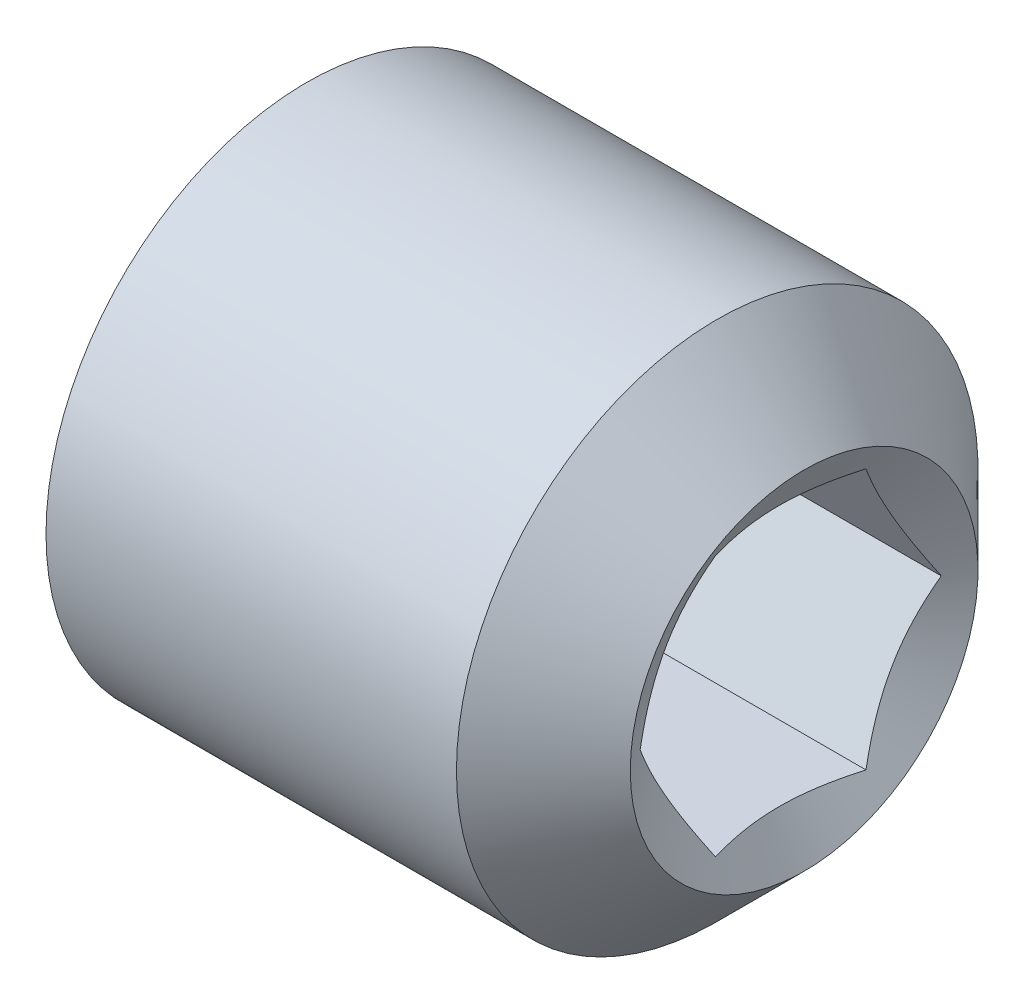
ISO-10303-21;
HEADER;
FILE_DESCRIPTION(('STEP AP214'),'2;1');
FILE_NAME('part.step','',(''),(''),'','','');
FILE_SCHEMA(('AUTOMOTIVE_DESIGN { 1 0 10303 214 1 1 1 1 }'));
ENDSEC;
DATA;
#1=APPLICATION_CONTEXT('core data for automotive mechanical design processes');
#2=APPLICATION_PROTOCOL_DEFINITION('international standard','automotive_design',2000,#1);
#3=PRODUCT_CONTEXT('',#1,'mechanical');
#4=PRODUCT('Part','Part','',(#3));
#5=PRODUCT_RELATED_PRODUCT_CATEGORY('part','',(#4));
#6=PRODUCT_DEFINITION_FORMATION('','',#4);
#7=PRODUCT_DEFINITION_CONTEXT('part definition',#1,'design');
#8=PRODUCT_DEFINITION('design','',#6,#7);
#9=PRODUCT_DEFINITION_SHAPE('','',#8);
#10=(LENGTH_UNIT() NAMED_UNIT(*) SI_UNIT(.MILLI.,.METRE.));
#11=(NAMED_UNIT(*) PLANE_ANGLE_UNIT() SI_UNIT($,.RADIAN.));
#12=(NAMED_UNIT(*) SI_UNIT($,.STERADIAN.) SOLID_ANGLE_UNIT());
#13=UNCERTAINTY_MEASURE_WITH_UNIT(LENGTH_MEASURE(1.E-05),#10,'distance_accuracy_value','');
#14=(GEOMETRIC_REPRESENTATION_CONTEXT(3) GLOBAL_UNCERTAINTY_ASSIGNED_CONTEXT((#13)) GLOBAL_UNIT_ASSIGNED_CONTEXT((#10,
#11,#12)) REPRESENTATION_CONTEXT('',''));
#15=CARTESIAN_POINT('',(0.,0.,0.));
#16=DIRECTION('',(0.,0.,1.));
#17=DIRECTION('',(1.,0.,0.));
#18=AXIS2_PLACEMENT_3D('',#15,#16,#17);
#19=CARTESIAN_POINT('',(0.,0.,0.));
#20=DIRECTION('',(-1.,0.,0.));
#21=DIRECTION('',(0.,0.,1.));
#22=AXIS2_PLACEMENT_3D('',#19,#20,#21);
#23=PLANE('',#22);
#24=CARTESIAN_POINT('',(0.,0.,0.));
#25=DIRECTION('',(-1.,0.,0.));
#26=DIRECTION('',(0.,0.,1.));
#27=AXIS2_PLACEMENT_3D('',#24,#25,#26);
#28=CIRCLE('',#27,5.036);
#29=CARTESIAN_POINT('',(0.,0.,5.036));
#30=VERTEX_POINT('',#29);
#31=EDGE_CURVE('E138',#30,#30,#28,.T.);
#32=ORIENTED_EDGE('',*,*,#31,.T.);
#33=EDGE_LOOP('',(#32));
#34=FACE_BOUND('',#33,.T.);
#35=DIRECTION('',(0.,0.,-1.));
#36=VECTOR('',#35,1.);
#37=CARTESIAN_POINT('',(0.,3.,1.73205080756888));
#38=LINE('',#37,#36);
#39=CARTESIAN_POINT('',(0.,3.,1.73205080756888));
#40=VERTEX_POINT('',#39);
#41=CARTESIAN_POINT('',(0.,3.,-1.73205080756888));
#42=VERTEX_POINT('',#41);
#43=EDGE_CURVE('E111',#40,#42,#38,.T.);
#44=ORIENTED_EDGE('',*,*,#43,.F.);
#45=DIRECTION('',(0.,-0.866025403784439,0.5));
#46=VECTOR('',#45,1.);
#47=CARTESIAN_POINT('',(0.,3.,1.73205080756888));
#48=LINE('',#47,#46);
#49=CARTESIAN_POINT('',(0.,0.,3.46410161513775));
#50=VERTEX_POINT('',#49);
#51=EDGE_CURVE('E55',#40,#50,#48,.T.);
#52=ORIENTED_EDGE('',*,*,#51,.T.);
#53=DIRECTION('',(0.,0.866025403784439,0.5));
#54=VECTOR('',#53,1.);
#55=CARTESIAN_POINT('',(0.,-3.,1.73205080756888));
#56=LINE('',#55,#54);
#57=CARTESIAN_POINT('',(0.,-3.,1.73205080756888));
#58=VERTEX_POINT('',#57);
#59=EDGE_CURVE('E101',#58,#50,#56,.T.);
#60=ORIENTED_EDGE('',*,*,#59,.F.);
#61=DIRECTION('',(0.,0.,-1.));
#62=VECTOR('',#61,1.);
#63=CARTESIAN_POINT('',(0.,-3.,1.73205080756888));
#64=LINE('',#63,#62);
#65=CARTESIAN_POINT('',(0.,-3.,-1.73205080756888));
#66=VERTEX_POINT('',#65);
#67=EDGE_CURVE('E107',#58,#66,#64,.T.);
#68=ORIENTED_EDGE('',*,*,#67,.T.);
#69=DIRECTION('',(0.,0.866025403784439,-0.5));
#70=VECTOR('',#69,1.);
#71=CARTESIAN_POINT('',(0.,-3.,-1.73205080756888));
#72=LINE('',#71,#70);
#73=CARTESIAN_POINT('',(0.,0.,-3.46410161513776));
#74=VERTEX_POINT('',#73);
#75=EDGE_CURVE('E115',#66,#74,#72,.T.);
#76=ORIENTED_EDGE('',*,*,#75,.T.);
#77=DIRECTION('',(0.,-0.866025403784439,-0.5));
#78=VECTOR('',#77,1.);
#79=CARTESIAN_POINT('',(0.,3.,-1.73205080756888));
#80=LINE('',#79,#78);
#81=EDGE_CURVE('E118',#42,#74,#80,.T.);
#82=ORIENTED_EDGE('',*,*,#81,.F.);
#83=EDGE_LOOP('',(#44,#52,#60,#68,#76,#82));
#84=FACE_BOUND('',#83,.T.);
#85=ADVANCED_FACE('F35',(#34,#84),#23,.T.);
#86=CARTESIAN_POINT('',(9.69059892324151,0.,0.));
#87=DIRECTION('',(1.,0.,0.));
#88=DIRECTION('',(0.,0.,-1.));
#89=AXIS2_PLACEMENT_3D('',#86,#87,#88);
#90=CONICAL_SURFACE('',#89,0.,1.0471975511966);
#91=CARTESIAN_POINT('',(12.,0.,0.));
#92=DIRECTION('',(-1.,0.,0.));
#93=DIRECTION('',(0.,0.,1.));
#94=AXIS2_PLACEMENT_3D('',#91,#92,#93);
#95=CIRCLE('',#94,4.);
#96=CARTESIAN_POINT('',(12.,0.,4.));
#97=VERTEX_POINT('',#96);
#98=EDGE_CURVE('E97',#97,#97,#95,.T.);
#99=ORIENTED_EDGE('',*,*,#98,.F.);
#100=EDGE_LOOP('',(#99));
#101=FACE_BOUND('',#100,.T.);
#102=CARTESIAN_POINT('',(11.6906655932414,3.0002,1.73193533751504));
#103=CARTESIAN_POINT('',(11.6467034352627,2.86836479341167,1.80805042952748));
#104=CARTESIAN_POINT('',(11.606721317103,2.73539159464476,1.88482254163057));
#105=CARTESIAN_POINT('',(11.5369318112558,2.46714257999795,2.03969618244675));
#106=CARTESIAN_POINT('',(11.5071491130758,2.33186199736566,2.11780046324563));
#107=CARTESIAN_POINT('',(11.4607875700216,2.06297739790352,2.27304105912604));
#108=CARTESIAN_POINT('',(11.4439001719333,1.92941475457054,2.35015348720802));
#109=CARTESIAN_POINT('',(11.4237393732589,1.66166094270431,2.50474122256553));
#110=CARTESIAN_POINT('',(11.4204492785915,1.52747074752016,2.58221596787771));
#111=CARTESIAN_POINT('',(11.4272902616958,1.2767244023042,2.72698443778646));
#112=CARTESIAN_POINT('',(11.435741645003,1.16013073502733,2.79429982297457));
#113=CARTESIAN_POINT('',(11.4625286738174,0.927703015025367,2.92849202968483));
#114=CARTESIAN_POINT('',(11.4808734716721,0.811869766348672,2.99536838698943));
#115=CARTESIAN_POINT('',(11.5267344816637,0.578962742943636,3.12983731964848));
#116=CARTESIAN_POINT('',(11.5544451160735,0.461918449486062,3.19741287398332));
#117=CARTESIAN_POINT('',(11.6173375259478,0.229575649500878,3.33155605209904));
#118=CARTESIAN_POINT('',(11.6525045218319,0.114274165828896,3.39812539473502));
#119=CARTESIAN_POINT('',(11.6906655932414,-0.000199999999997181,3.46421708519159));
#120=B_SPLINE_CURVE_WITH_KNOTS('',3,(#102,#103,#104,#105,#106,#107,#108,#109,#110,#111,#112,
#113,#114,#115,#116,#117,#118,#119),.UNSPECIFIED.,.F.,.F.,(4,2,2,2,2,2,2,2,4),(0.,
0.475539830103041,0.952222784107965,1.41710776961288,1.88142182298026,2.28572436316091,
2.69040156475039,3.10405572063576,3.5168974940707),.UNSPECIFIED.);
#121=CARTESIAN_POINT('',(11.6905989232415,3.,1.73205080756888));
#122=VERTEX_POINT('',#121);
#123=CARTESIAN_POINT('',(11.6905989232415,0.,3.46410161513775));
#124=VERTEX_POINT('',#123);
#125=EDGE_CURVE('E11',#122,#124,#120,.T.);
#126=ORIENTED_EDGE('',*,*,#125,.F.);
#127=CARTESIAN_POINT('',(12.840336640365,3.,-4.55659336127451));
#128=CARTESIAN_POINT('',(12.7775183066443,3.,-4.42628672844495));
#129=CARTESIAN_POINT('',(12.7153309655419,3.,-4.29567032494813));
#130=CARTESIAN_POINT('',(12.5925754309235,3.,-4.03365274149774));
#131=CARTESIAN_POINT('',(12.5320075139129,3.,-3.90225143215388));
#132=CARTESIAN_POINT('',(12.4125226094255,3.,-3.63777496634161));
#133=CARTESIAN_POINT('',(12.3536172920187,3.,-3.50469451834562));
#134=CARTESIAN_POINT('',(12.2383508803078,3.,-3.23744031909387));
#135=CARTESIAN_POINT('',(12.1819896584255,3.,-3.10326662306021));
#136=CARTESIAN_POINT('',(12.0709277695581,3.,-2.82977330303893));
#137=CARTESIAN_POINT('',(12.0163198280995,3.,-2.69041580838828));
#138=CARTESIAN_POINT('',(11.9114740307778,3.,-2.41003573054797));
#139=CARTESIAN_POINT('',(11.8612366777946,3.,-2.26901295786603));
#140=CARTESIAN_POINT('',(11.7665209311448,3.,-1.98537413289822));
#141=CARTESIAN_POINT('',(11.7220300182339,3.,-1.84276230547271));
#142=CARTESIAN_POINT('',(11.6402969069347,3.,-1.55549698900339));
#143=CARTESIAN_POINT('',(11.6030523235803,3.,-1.41084418856835));
#144=CARTESIAN_POINT('',(11.537839902926,3.,-1.12014497293236));
#145=CARTESIAN_POINT('',(11.5098288315497,3.,-0.974108444190145));
#146=CARTESIAN_POINT('',(11.4647495967925,3.,-0.680325608016572));
#147=CARTESIAN_POINT('',(11.4476805281331,3.,-0.532579443060636));
#148=CARTESIAN_POINT('',(11.4260708908031,3.,-0.23800167284546));
#149=CARTESIAN_POINT('',(11.421376892111,3.,-0.0911816042653944));
#150=CARTESIAN_POINT('',(11.4245169584137,3.,0.202335554134728));
#151=CARTESIAN_POINT('',(11.4323516727024,3.,0.349032637186917));
#152=CARTESIAN_POINT('',(11.4560257507122,3.,0.600951629579026));
#153=CARTESIAN_POINT('',(11.469060608016,3.,0.706450994842633));
#154=CARTESIAN_POINT('',(11.5007453308884,3.,0.916609115223871));
#155=CARTESIAN_POINT('',(11.5193960393217,3.,1.02126774173529));
#156=CARTESIAN_POINT('',(11.5827840958792,3.,1.33387598596371));
#157=CARTESIAN_POINT('',(11.6349442068949,3.,1.54033357100199));
#158=CARTESIAN_POINT('',(11.7245575357159,3.,1.84908487891427));
#159=CARTESIAN_POINT('',(11.7567482398301,3.,1.95299589282556));
#160=CARTESIAN_POINT('',(11.8242569956809,3.,2.1598068394969));
#161=CARTESIAN_POINT('',(11.8595750701436,3.,2.2627067649035));
#162=CARTESIAN_POINT('',(11.9327896613409,3.,2.46753423262475));
#163=CARTESIAN_POINT('',(11.9706852263751,3.,2.5694621181701));
#164=CARTESIAN_POINT('',(12.0486305002987,3.,2.77248625415285));
#165=CARTESIAN_POINT('',(12.0886801686461,3.,2.87358252020081));
#166=CARTESIAN_POINT('',(12.1962687561814,3.,3.13826972104612));
#167=CARTESIAN_POINT('',(12.2652842000421,3.,3.30125980379003));
#168=CARTESIAN_POINT('',(12.4068707022034,3.,3.62569332832884));
#169=CARTESIAN_POINT('',(12.4794420705356,3.,3.78713663379199));
#170=CARTESIAN_POINT('',(12.627315499474,3.,4.10881818146874));
#171=CARTESIAN_POINT('',(12.7026183093158,3.00000000000001,4.26905607826113));
#172=CARTESIAN_POINT('',(12.8553307943668,3.00000000000001,4.58852645189722));
#173=CARTESIAN_POINT('',(12.9327405221607,3.00000000000001,4.74775890352445));
#174=CARTESIAN_POINT('',(13.1676336135943,3.00000000000001,5.22465756645368));
#175=CARTESIAN_POINT('',(13.327585417931,3.00000000000001,5.54110663352526));
#176=CARTESIAN_POINT('',(13.6516726538817,3.00000000000001,6.17177335504186));
#177=CARTESIAN_POINT('',(13.8158073859139,3.00000000000001,6.48599137152855));
#178=CARTESIAN_POINT('',(14.1305139282583,3.00000000000001,7.08177137884172));
#179=CARTESIAN_POINT('',(14.2808137659135,3.00000000000001,7.36347726630862));
#180=CARTESIAN_POINT('',(14.5831324665193,3.00000000000001,7.92598154858902));
#181=CARTESIAN_POINT('',(14.7351514137229,3.00000000000001,8.20677989804955));
#182=CARTESIAN_POINT('',(15.040043621536,3.00000000000001,8.76689184921073));
#183=CARTESIAN_POINT('',(15.1929132935827,3.00000000000001,9.04620740650452));
#184=CARTESIAN_POINT('',(15.4996413094233,3.00000000000001,9.60427181112733));
#185=CARTESIAN_POINT('',(15.653499588575,3.00000000000001,9.88302069397183));
#186=CARTESIAN_POINT('',(15.8077189294779,3.00000000000001,10.1615683588752));
#187=B_SPLINE_CURVE_WITH_KNOTS('',3,(#127,#128,#129,#130,#131,#132,#133,#134,#135,#136,#137,
#138,#139,#140,#141,#142,#143,#144,#145,#146,#147,#148,#149,#150,#151,#152,#153,#154,#155,#156,
#157,#158,#159,#160,#161,#162,#163,#164,#165,#166,#167,#168,#169,#170,#171,#172,#173,#174,#175,
#176,#177,#178,#179,#180,#181,#182,#183,#184,#185,#186),.UNSPECIFIED.,.F.,.F.,(4,2,2,2,2,2,2,2,
2,2,2,2,2,2,2,2,2,2,2,2,2,2,2,2,2,2,2,2,2,4),(0.,0.433980061359352,0.868033754620581,
1.30461549717309,1.74117532217407,2.19014305696267,2.63916238183425,3.08718634825249,
3.53506260730817,3.98081095903989,4.42652242734654,4.86668125465067,5.30686289369446,
5.62561131441227,5.94440759890004,6.58237376963243,6.9086979291812,7.23502446026578,
7.56123114742701,7.88743169723455,8.41836853092384,8.94935173825066,9.48048171260251,
10.0116249551526,11.0752966882769,12.138791678188,13.0966636327847,14.0545827376494,
15.0098170543448,15.9649895339161),.UNSPECIFIED.);
#188=CARTESIAN_POINT('',(11.6905989232415,3.,-1.73205080756888));
#189=VERTEX_POINT('',#188);
#190=EDGE_CURVE('E141',#122,#189,#187,.F.);
#191=ORIENTED_EDGE('',*,*,#190,.T.);
#192=CARTESIAN_POINT('',(11.6906655932414,3.0002,-1.73193533751504));
#193=CARTESIAN_POINT('',(11.6467034352627,2.86836479341167,-1.80805042952749));
#194=CARTESIAN_POINT('',(11.606721317103,2.73539159464475,-1.88482254163057));
#195=CARTESIAN_POINT('',(11.5369318112558,2.46714257999795,-2.03969618244676));
#196=CARTESIAN_POINT('',(11.5071491130758,2.33186199736566,-2.11780046324564));
#197=CARTESIAN_POINT('',(11.4607875700216,2.06297739790352,-2.27304105912605));
#198=CARTESIAN_POINT('',(11.4439001719333,1.92941475457054,-2.35015348720802));
#199=CARTESIAN_POINT('',(11.4237393732589,1.66166094270431,-2.50474122256554));
#200=CARTESIAN_POINT('',(11.4204492785915,1.52747074752016,-2.58221596787772));
#201=CARTESIAN_POINT('',(11.4272902616958,1.27672440230419,-2.72698443778647));
#202=CARTESIAN_POINT('',(11.435741645003,1.16013073502733,-2.79429982297458));
#203=CARTESIAN_POINT('',(11.4625286738174,0.927703015025365,-2.92849202968484));
#204=CARTESIAN_POINT('',(11.4808734716721,0.81186976634867,-2.99536838698944));
#205=CARTESIAN_POINT('',(11.5267344816637,0.578962742943634,-3.12983731964849));
#206=CARTESIAN_POINT('',(11.5544451160735,0.461918449486061,-3.19741287398333));
#207=CARTESIAN_POINT('',(11.6173375259478,0.229575649500877,-3.33155605209905));
#208=CARTESIAN_POINT('',(11.6525045218319,0.114274165828896,-3.39812539473503));
#209=CARTESIAN_POINT('',(11.6906655932414,-0.000199999999997537,-3.4642170851916));
#210=B_SPLINE_CURVE_WITH_KNOTS('',3,(#192,#193,#194,#195,#196,#197,#198,#199,#200,#201,#202,
#203,#204,#205,#206,#207,#208,#209),.UNSPECIFIED.,.F.,.F.,(4,2,2,2,2,2,2,2,4),(0.,
0.475539830103041,0.952222784107966,1.41710776961288,1.88142182298026,2.28572436316091,
2.69040156475039,3.10405572063576,3.5168974940707),.UNSPECIFIED.);
#211=CARTESIAN_POINT('',(11.6905989232415,0.,-3.46410161513776));
#212=VERTEX_POINT('',#211);
#213=EDGE_CURVE('E149',#189,#212,#210,.T.);
#214=ORIENTED_EDGE('',*,*,#213,.T.);
#215=CARTESIAN_POINT('',(11.6906655932414,-3.0002,-1.73193533751504));
#216=CARTESIAN_POINT('',(11.6467034352627,-2.86836479341167,-1.80805042952749));
#217=CARTESIAN_POINT('',(11.606721317103,-2.73539159464475,-1.88482254163057));
#218=CARTESIAN_POINT('',(11.5369318112558,-2.46714257999794,-2.03969618244676));
#219=CARTESIAN_POINT('',(11.5071491130758,-2.33186199736566,-2.11780046324564));
#220=CARTESIAN_POINT('',(11.4607875700216,-2.06297739790352,-2.27304105912605));
#221=CARTESIAN_POINT('',(11.4439001719333,-1.92941475457054,-2.35015348720802));
#222=CARTESIAN_POINT('',(11.4237393732589,-1.66166094270431,-2.50474122256554));
#223=CARTESIAN_POINT('',(11.4204492785915,-1.52747074752016,-2.58221596787772));
#224=CARTESIAN_POINT('',(11.4272902616958,-1.27672440230419,-2.72698443778647));
#225=CARTESIAN_POINT('',(11.435741645003,-1.16013073502732,-2.79429982297457));
#226=CARTESIAN_POINT('',(11.4625286738174,-0.927703015025362,-2.92849202968484));
#227=CARTESIAN_POINT('',(11.4808734716721,-0.811869766348667,-2.99536838698944));
#228=CARTESIAN_POINT('',(11.5267344816637,-0.57896274294363,-3.12983731964849));
#229=CARTESIAN_POINT('',(11.5544451160735,-0.461918449486057,-3.19741287398333));
#230=CARTESIAN_POINT('',(11.6173375259478,-0.229575649500873,-3.33155605209904));
#231=CARTESIAN_POINT('',(11.6525045218319,-0.114274165828892,-3.39812539473503));
#232=CARTESIAN_POINT('',(11.6906655932414,0.000200000000001906,-3.4642170851916));
#233=B_SPLINE_CURVE_WITH_KNOTS('',3,(#215,#216,#217,#218,#219,#220,#221,#222,#223,#224,#225,
#226,#227,#228,#229,#230,#231,#232),.UNSPECIFIED.,.F.,.F.,(4,2,2,2,2,2,2,2,4),(0.,
0.475539830103041,0.952222784107964,1.41710776961288,1.88142182298026,2.28572436316091,
2.69040156475039,3.10405572063576,3.5168974940707),.UNSPECIFIED.);
#234=CARTESIAN_POINT('',(11.6905989232415,-3.,-1.73205080756888));
#235=VERTEX_POINT('',#234);
#236=EDGE_CURVE('E173',#235,#212,#233,.T.);
#237=ORIENTED_EDGE('',*,*,#236,.F.);
#238=CARTESIAN_POINT('',(12.840336640365,-3.,-4.55659336127451));
#239=CARTESIAN_POINT('',(12.7775183066443,-3.,-4.42628672844495));
#240=CARTESIAN_POINT('',(12.7153309655419,-3.,-4.29567032494812));
#241=CARTESIAN_POINT('',(12.5925754309234,-3.,-4.03365274149773));
#242=CARTESIAN_POINT('',(12.5320075139129,-3.,-3.90225143215387));
#243=CARTESIAN_POINT('',(12.4125226094255,-3.,-3.63777496634161));
#244=CARTESIAN_POINT('',(12.3536172920187,-3.,-3.50469451834562));
#245=CARTESIAN_POINT('',(12.2383508803078,-3.,-3.23744031909386));
#246=CARTESIAN_POINT('',(12.1819896584255,-3.,-3.10326662306021));
#247=CARTESIAN_POINT('',(12.0709277695581,-3.,-2.82977330303893));
#248=CARTESIAN_POINT('',(12.0163198280995,-3.,-2.69041580838827));
#249=CARTESIAN_POINT('',(11.9114740307778,-3.,-2.41003573054797));
#250=CARTESIAN_POINT('',(11.8612366777946,-3.,-2.26901295786603));
#251=CARTESIAN_POINT('',(11.7665209311448,-3.,-1.98537413289822));
#252=CARTESIAN_POINT('',(11.7220300182339,-3.,-1.84276230547271));
#253=CARTESIAN_POINT('',(11.6402969069347,-3.,-1.55549698900339));
#254=CARTESIAN_POINT('',(11.6030523235803,-3.,-1.41084418856835));
#255=CARTESIAN_POINT('',(11.537839902926,-3.,-1.12014497293236));
#256=CARTESIAN_POINT('',(11.5098288315497,-3.,-0.974108444190145));
#257=CARTESIAN_POINT('',(11.4647495967925,-3.,-0.680325608016572));
#258=CARTESIAN_POINT('',(11.4476805281331,-3.,-0.532579443060637));
#259=CARTESIAN_POINT('',(11.4260708908031,-3.,-0.238001672845461));
#260=CARTESIAN_POINT('',(11.421376892111,-3.,-0.0911816042653956));
#261=CARTESIAN_POINT('',(11.4245169584136,-3.,0.202335554134726));
#262=CARTESIAN_POINT('',(11.4323516727024,-3.,0.349032637186915));
#263=CARTESIAN_POINT('',(11.4560257507122,-3.,0.600951629579023));
#264=CARTESIAN_POINT('',(11.469060608016,-3.,0.70645099484263));
#265=CARTESIAN_POINT('',(11.5007453308884,-3.,0.916609115223868));
#266=CARTESIAN_POINT('',(11.5193960393217,-3.,1.02126774173529));
#267=CARTESIAN_POINT('',(11.5827840958792,-3.,1.33387598596371));
#268=CARTESIAN_POINT('',(11.6349442068949,-3.,1.54033357100199));
#269=CARTESIAN_POINT('',(11.7245575357159,-3.,1.84908487891426));
#270=CARTESIAN_POINT('',(11.7567482398301,-3.,1.95299589282556));
#271=CARTESIAN_POINT('',(11.8242569956809,-3.,2.15980683949689));
#272=CARTESIAN_POINT('',(11.8595750701436,-3.,2.2627067649035));
#273=CARTESIAN_POINT('',(11.9327896613409,-3.,2.46753423262474));
#274=CARTESIAN_POINT('',(11.9706852263751,-3.,2.56946211817009));
#275=CARTESIAN_POINT('',(12.0486305002987,-3.,2.77248625415284));
#276=CARTESIAN_POINT('',(12.0886801686461,-3.,2.8735825202008));
#277=CARTESIAN_POINT('',(12.1962687561814,-3.,3.13826972104611));
#278=CARTESIAN_POINT('',(12.2652842000421,-3.,3.30125980379003));
#279=CARTESIAN_POINT('',(12.4068707022034,-3.,3.62569332832883));
#280=CARTESIAN_POINT('',(12.4794420705356,-3.,3.78713663379198));
#281=CARTESIAN_POINT('',(12.627315499474,-3.,4.10881818146874));
#282=CARTESIAN_POINT('',(12.7026183093158,-3.,4.26905607826112));
#283=CARTESIAN_POINT('',(12.8553307943668,-3.,4.58852645189721));
#284=CARTESIAN_POINT('',(12.9327405221607,-3.,4.74775890352444));
#285=CARTESIAN_POINT('',(13.1676336135943,-3.,5.22465756645368));
#286=CARTESIAN_POINT('',(13.327585417931,-3.,5.54110663352525));
#287=CARTESIAN_POINT('',(13.6516726538817,-3.,6.17177335504186));
#288=CARTESIAN_POINT('',(13.8158073859139,-3.,6.48599137152855));
#289=CARTESIAN_POINT('',(14.1305139282583,-3.,7.08177137884172));
#290=CARTESIAN_POINT('',(14.2808137659135,-3.,7.36347726630862));
#291=CARTESIAN_POINT('',(14.5831324665193,-3.,7.92598154858901));
#292=CARTESIAN_POINT('',(14.7351514137229,-3.,8.20677989804954));
#293=CARTESIAN_POINT('',(15.040043621536,-3.,8.76689184921073));
#294=CARTESIAN_POINT('',(15.1929132935827,-3.,9.04620740650452));
#295=CARTESIAN_POINT('',(15.4996413094233,-3.,9.60427181112733));
#296=CARTESIAN_POINT('',(15.653499588575,-3.,9.88302069397182));
#297=CARTESIAN_POINT('',(15.8077189294779,-3.,10.1615683588752));
#298=B_SPLINE_CURVE_WITH_KNOTS('',3,(#238,#239,#240,#241,#242,#243,#244,#245,#246,#247,#248,
#249,#250,#251,#252,#253,#254,#255,#256,#257,#258,#259,#260,#261,#262,#263,#264,#265,#266,#267,
#268,#269,#270,#271,#272,#273,#274,#275,#276,#277,#278,#279,#280,#281,#282,#283,#284,#285,#286,
#287,#288,#289,#290,#291,#292,#293,#294,#295,#296,#297),.UNSPECIFIED.,.F.,.F.,(4,2,2,2,2,2,2,2,
2,2,2,2,2,2,2,2,2,2,2,2,2,2,2,2,2,2,2,2,2,4),(0.,0.433980061359352,0.868033754620581,
1.30461549717309,1.74117532217406,2.19014305696267,2.63916238183424,3.08718634825249,
3.53506260730817,3.98081095903988,4.42652242734654,4.86668125465067,5.30686289369446,
5.62561131441226,5.94440759890004,6.58237376963242,6.90869792918119,7.23502446026577,
7.561231147427,7.88743169723454,8.41836853092383,8.94935173825065,9.48048171260251,
10.0116249551526,11.0752966882769,12.138791678188,13.0966636327847,14.0545827376493,
15.0098170543448,15.9649895339161),.UNSPECIFIED.);
#299=CARTESIAN_POINT('',(11.6905989232415,-3.,1.73205080756888));
#300=VERTEX_POINT('',#299);
#301=EDGE_CURVE('E180',#300,#235,#298,.F.);
#302=ORIENTED_EDGE('',*,*,#301,.F.);
#303=CARTESIAN_POINT('',(11.6906655932414,-3.0002,1.73193533751504));
#304=CARTESIAN_POINT('',(11.6467034352627,-2.86836479341167,1.80805042952748));
#305=CARTESIAN_POINT('',(11.606721317103,-2.73539159464475,1.88482254163057));
#306=CARTESIAN_POINT('',(11.5369318112558,-2.46714257999794,2.03969618244675));
#307=CARTESIAN_POINT('',(11.5071491130758,-2.33186199736566,2.11780046324563));
#308=CARTESIAN_POINT('',(11.4607875700216,-2.06297739790352,2.27304105912604));
#309=CARTESIAN_POINT('',(11.4439001719333,-1.92941475457054,2.35015348720802));
#310=CARTESIAN_POINT('',(11.4237393732589,-1.66166094270431,2.50474122256553));
#311=CARTESIAN_POINT('',(11.4204492785915,-1.52747074752016,2.58221596787771));
#312=CARTESIAN_POINT('',(11.4272902616958,-1.27672440230419,2.72698443778646));
#313=CARTESIAN_POINT('',(11.435741645003,-1.16013073502732,2.79429982297457));
#314=CARTESIAN_POINT('',(11.4625286738174,-0.927703015025363,2.92849202968483));
#315=CARTESIAN_POINT('',(11.4808734716721,-0.811869766348668,2.99536838698943));
#316=CARTESIAN_POINT('',(11.5267344816637,-0.578962742943631,3.12983731964848));
#317=CARTESIAN_POINT('',(11.5544451160735,-0.461918449486058,3.19741287398332));
#318=CARTESIAN_POINT('',(11.6173375259478,-0.229575649500873,3.33155605209904));
#319=CARTESIAN_POINT('',(11.6525045218319,-0.114274165828891,3.39812539473502));
#320=CARTESIAN_POINT('',(11.6906655932414,0.000200000000002878,3.46421708519159));
#321=B_SPLINE_CURVE_WITH_KNOTS('',3,(#303,#304,#305,#306,#307,#308,#309,#310,#311,#312,#313,
#314,#315,#316,#317,#318,#319,#320),.UNSPECIFIED.,.F.,.F.,(4,2,2,2,2,2,2,2,4),(0.,
0.47553983010304,0.952222784107963,1.41710776961288,1.88142182298026,2.28572436316091,
2.69040156475039,3.10405572063576,3.5168974940707),.UNSPECIFIED.);
#322=EDGE_CURVE('E48',#300,#124,#321,.T.);
#323=ORIENTED_EDGE('',*,*,#322,.T.);
#324=EDGE_LOOP('',(#126,#191,#214,#237,#302,#323));
#325=FACE_BOUND('',#324,.T.);
#326=ADVANCED_FACE('F158',(#101,#325),#90,.F.);
#327=CARTESIAN_POINT('',(0.,0.,0.));
#328=DIRECTION('',(1.,0.,0.));
#329=DIRECTION('',(0.,0.,-1.));
#330=AXIS2_PLACEMENT_3D('',#327,#328,#329);
#331=CONICAL_SURFACE('',#330,5.036,1.0471975511966);
#332=CARTESIAN_POINT('',(0.556565659498794,0.,0.));
#333=DIRECTION('',(-1.,0.,0.));
#334=DIRECTION('',(0.,0.,1.));
#335=AXIS2_PLACEMENT_3D('',#332,#333,#334);
#336=CIRCLE('',#335,6.);
#337=CARTESIAN_POINT('',(0.556565659498794,0.,6.));
#338=VERTEX_POINT('',#337);
#339=EDGE_CURVE('E135',#338,#338,#336,.T.);
#340=ORIENTED_EDGE('',*,*,#339,.T.);
#341=EDGE_LOOP('',(#340));
#342=FACE_BOUND('',#341,.T.);
#343=ORIENTED_EDGE('',*,*,#31,.F.);
#344=EDGE_LOOP('',(#343));
#345=FACE_BOUND('',#344,.T.);
#346=ADVANCED_FACE('F162',(#342,#345),#331,.T.);
#347=CARTESIAN_POINT('',(-12.7,0.,0.));
#348=DIRECTION('',(-1.,0.,0.));
#349=DIRECTION('',(0.,0.,1.));
#350=AXIS2_PLACEMENT_3D('',#347,#348,#349);
#351=CYLINDRICAL_SURFACE('',#350,6.);
#352=CARTESIAN_POINT('',(10.,0.,0.));
#353=DIRECTION('',(-1.,0.,0.));
#354=DIRECTION('',(0.,0.,1.));
#355=AXIS2_PLACEMENT_3D('',#352,#353,#354);
#356=CIRCLE('',#355,6.);
#357=CARTESIAN_POINT('',(10.,0.,6.));
#358=VERTEX_POINT('',#357);
#359=EDGE_CURVE('E132',#358,#358,#356,.T.);
#360=ORIENTED_EDGE('',*,*,#359,.T.);
#361=EDGE_LOOP('',(#360));
#362=FACE_BOUND('',#361,.T.);
#363=ORIENTED_EDGE('',*,*,#339,.F.);
#364=EDGE_LOOP('',(#363));
#365=FACE_BOUND('',#364,.T.);
#366=ADVANCED_FACE('F214',(#362,#365),#351,.T.);
#367=CARTESIAN_POINT('',(10.,0.,0.));
#368=DIRECTION('',(-1.,0.,0.));
#369=DIRECTION('',(0.,0.,1.));
#370=AXIS2_PLACEMENT_3D('',#367,#368,#369);
#371=CONICAL_SURFACE('',#370,6.,0.78539816339745);
#372=ORIENTED_EDGE('',*,*,#98,.T.);
#373=EDGE_LOOP('',(#372));
#374=FACE_BOUND('',#373,.T.);
#375=ORIENTED_EDGE('',*,*,#359,.F.);
#376=EDGE_LOOP('',(#375));
#377=FACE_BOUND('',#376,.T.);
#378=ADVANCED_FACE('F166',(#374,#377),#371,.T.);
#379=CARTESIAN_POINT('',(12.,3.,1.73205080756888));
#380=DIRECTION('',(0.,-0.5,-0.866025403784439));
#381=DIRECTION('',(0.,0.866025403784439,-0.5));
#382=AXIS2_PLACEMENT_3D('',#379,#380,#381);
#383=PLANE('',#382);
#384=ORIENTED_EDGE('',*,*,#125,.T.);
#385=DIRECTION('',(-1.,0.,0.));
#386=VECTOR('',#385,1.);
#387=CARTESIAN_POINT('',(12.,0.,3.46410161513775));
#388=LINE('',#387,#386);
#389=EDGE_CURVE('E91',#124,#50,#388,.T.);
#390=ORIENTED_EDGE('',*,*,#389,.T.);
#391=ORIENTED_EDGE('',*,*,#51,.F.);
#392=DIRECTION('',(-1.,0.,0.));
#393=VECTOR('',#392,1.);
#394=CARTESIAN_POINT('',(12.,3.,1.73205080756888));
#395=LINE('',#394,#393);
#396=EDGE_CURVE('E122',#122,#40,#395,.T.);
#397=ORIENTED_EDGE('',*,*,#396,.F.);
#398=EDGE_LOOP('',(#384,#390,#391,#397));
#399=FACE_BOUND('',#398,.T.);
#400=ADVANCED_FACE('F93',(#399),#383,.T.);
#401=CARTESIAN_POINT('',(12.,-3.,1.73205080756888));
#402=DIRECTION('',(0.,-0.5,0.866025403784439));
#403=DIRECTION('',(0.,-0.866025403784439,-0.5));
#404=AXIS2_PLACEMENT_3D('',#401,#402,#403);
#405=PLANE('',#404);
#406=DIRECTION('',(-1.,0.,0.));
#407=VECTOR('',#406,1.);
#408=CARTESIAN_POINT('',(12.,-3.,1.73205080756888));
#409=LINE('',#408,#407);
#410=EDGE_CURVE('E98',#300,#58,#409,.T.);
#411=ORIENTED_EDGE('',*,*,#410,.T.);
#412=ORIENTED_EDGE('',*,*,#59,.T.);
#413=ORIENTED_EDGE('',*,*,#389,.F.);
#414=ORIENTED_EDGE('',*,*,#322,.F.);
#415=EDGE_LOOP('',(#411,#412,#413,#414));
#416=FACE_BOUND('',#415,.T.);
#417=ADVANCED_FACE('F102',(#416),#405,.F.);
#418=CARTESIAN_POINT('',(12.,-3.,1.73205080756888));
#419=DIRECTION('',(0.,1.,0.));
#420=DIRECTION('',(0.,0.,1.));
#421=AXIS2_PLACEMENT_3D('',#418,#419,#420);
#422=PLANE('',#421);
#423=ORIENTED_EDGE('',*,*,#301,.T.);
#424=DIRECTION('',(-1.,0.,0.));
#425=VECTOR('',#424,1.);
#426=CARTESIAN_POINT('',(12.,-3.,-1.73205080756888));
#427=LINE('',#426,#425);
#428=EDGE_CURVE('E127',#235,#66,#427,.T.);
#429=ORIENTED_EDGE('',*,*,#428,.T.);
#430=ORIENTED_EDGE('',*,*,#67,.F.);
#431=ORIENTED_EDGE('',*,*,#410,.F.);
#432=EDGE_LOOP('',(#423,#429,#430,#431));
#433=FACE_BOUND('',#432,.T.);
#434=ADVANCED_FACE('F192',(#433),#422,.T.);
#435=CARTESIAN_POINT('',(12.,-3.,-1.73205080756888));
#436=DIRECTION('',(0.,0.5,0.866025403784438));
#437=DIRECTION('',(0.,-0.866025403784439,0.5));
#438=AXIS2_PLACEMENT_3D('',#435,#436,#437);
#439=PLANE('',#438);
#440=ORIENTED_EDGE('',*,*,#236,.T.);
#441=DIRECTION('',(-1.,0.,0.));
#442=VECTOR('',#441,1.);
#443=CARTESIAN_POINT('',(12.,0.,-3.46410161513776));
#444=LINE('',#443,#442);
#445=EDGE_CURVE('E125',#212,#74,#444,.T.);
#446=ORIENTED_EDGE('',*,*,#445,.T.);
#447=ORIENTED_EDGE('',*,*,#75,.F.);
#448=ORIENTED_EDGE('',*,*,#428,.F.);
#449=EDGE_LOOP('',(#440,#446,#447,#448));
#450=FACE_BOUND('',#449,.T.);
#451=ADVANCED_FACE('F195',(#450),#439,.T.);
#452=CARTESIAN_POINT('',(12.,3.,-1.73205080756888));
#453=DIRECTION('',(0.,0.5,-0.866025403784439));
#454=DIRECTION('',(0.,0.866025403784439,0.5));
#455=AXIS2_PLACEMENT_3D('',#452,#453,#454);
#456=PLANE('',#455);
#457=DIRECTION('',(-1.,0.,0.));
#458=VECTOR('',#457,1.);
#459=CARTESIAN_POINT('',(12.,3.,-1.73205080756888));
#460=LINE('',#459,#458);
#461=EDGE_CURVE('E63',#189,#42,#460,.T.);
#462=ORIENTED_EDGE('',*,*,#461,.T.);
#463=ORIENTED_EDGE('',*,*,#81,.T.);
#464=ORIENTED_EDGE('',*,*,#445,.F.);
#465=ORIENTED_EDGE('',*,*,#213,.F.);
#466=EDGE_LOOP('',(#462,#463,#464,#465));
#467=FACE_BOUND('',#466,.T.);
#468=ADVANCED_FACE('F199',(#467),#456,.F.);
#469=CARTESIAN_POINT('',(12.,3.,1.73205080756888));
#470=DIRECTION('',(0.,1.,0.));
#471=DIRECTION('',(0.,0.,1.));
#472=AXIS2_PLACEMENT_3D('',#469,#470,#471);
#473=PLANE('',#472);
#474=ORIENTED_EDGE('',*,*,#396,.T.);
#475=ORIENTED_EDGE('',*,*,#43,.T.);
#476=ORIENTED_EDGE('',*,*,#461,.F.);
#477=ORIENTED_EDGE('',*,*,#190,.F.);
#478=EDGE_LOOP('',(#474,#475,#476,#477));
#479=FACE_BOUND('',#478,.T.);
#480=ADVANCED_FACE('F156',(#479),#473,.F.);
#481=CLOSED_SHELL('',(#85,#326,#346,#366,#378,#400,#417,#434,#451,#468,#480));
#482=MANIFOLD_SOLID_BREP('B2',#481);
#483=ADVANCED_BREP_SHAPE_REPRESENTATION('',(#18,#482),#14);
#484=SHAPE_DEFINITION_REPRESENTATION(#9,#483);
ENDSEC;
END-ISO-10303-21;
